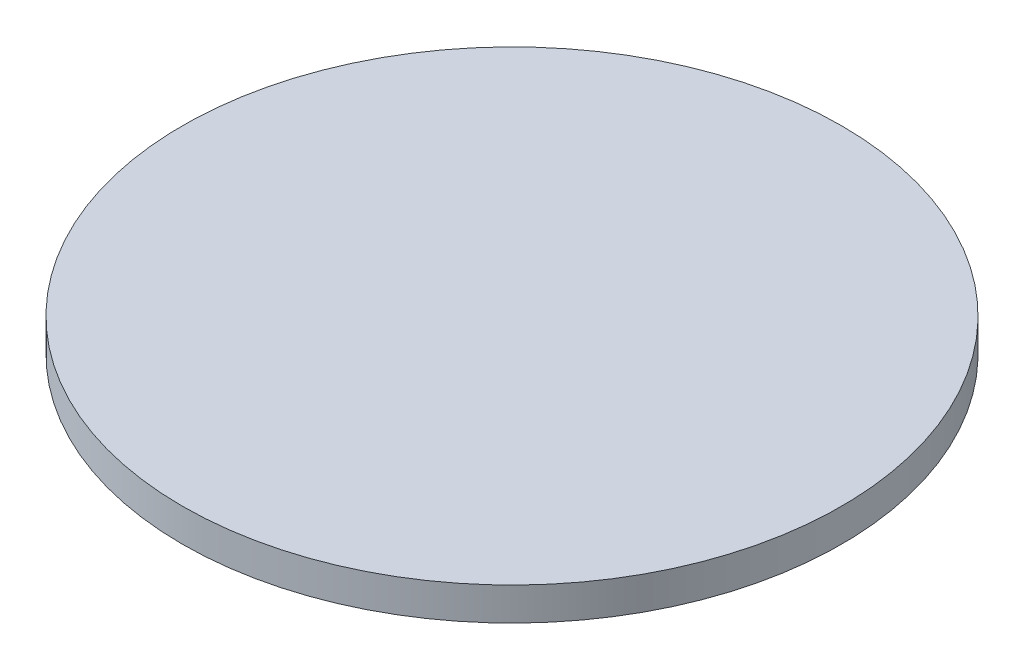
ISO-10303-21;
HEADER;
FILE_DESCRIPTION(('STEP AP214'),'2;1');
FILE_NAME('part.step','',(''),(''),'','','');
FILE_SCHEMA(('AUTOMOTIVE_DESIGN { 1 0 10303 214 1 1 1 1 }'));
ENDSEC;
DATA;
#1=APPLICATION_CONTEXT('core data for automotive mechanical design processes');
#2=APPLICATION_PROTOCOL_DEFINITION('international standard','automotive_design',2000,#1);
#3=PRODUCT_CONTEXT('',#1,'mechanical');
#4=PRODUCT('Part','Part','',(#3));
#5=PRODUCT_RELATED_PRODUCT_CATEGORY('part','',(#4));
#6=PRODUCT_DEFINITION_FORMATION('','',#4);
#7=PRODUCT_DEFINITION_CONTEXT('part definition',#1,'design');
#8=PRODUCT_DEFINITION('design','',#6,#7);
#9=PRODUCT_DEFINITION_SHAPE('','',#8);
#10=(LENGTH_UNIT() NAMED_UNIT(*) SI_UNIT(.MILLI.,.METRE.));
#11=(NAMED_UNIT(*) PLANE_ANGLE_UNIT() SI_UNIT($,.RADIAN.));
#12=(NAMED_UNIT(*) SI_UNIT($,.STERADIAN.) SOLID_ANGLE_UNIT());
#13=UNCERTAINTY_MEASURE_WITH_UNIT(LENGTH_MEASURE(1.E-05),#10,'distance_accuracy_value','');
#14=(GEOMETRIC_REPRESENTATION_CONTEXT(3) GLOBAL_UNCERTAINTY_ASSIGNED_CONTEXT((#13)) GLOBAL_UNIT_ASSIGNED_CONTEXT((#10,
#11,#12)) REPRESENTATION_CONTEXT('',''));
#15=CARTESIAN_POINT('',(0.,0.,0.));
#16=DIRECTION('',(0.,0.,1.));
#17=DIRECTION('',(1.,0.,0.));
#18=AXIS2_PLACEMENT_3D('',#15,#16,#17);
#19=CARTESIAN_POINT('',(0.,1.,0.));
#20=DIRECTION('',(0.,-1.,0.));
#21=DIRECTION('',(0.,0.,-1.));
#22=AXIS2_PLACEMENT_3D('',#19,#20,#21);
#23=CYLINDRICAL_SURFACE('',#22,20.);
#24=CARTESIAN_POINT('',(0.,1.,0.));
#25=DIRECTION('',(0.,1.,0.));
#26=DIRECTION('',(0.,0.,1.));
#27=AXIS2_PLACEMENT_3D('',#24,#25,#26);
#28=CIRCLE('',#27,20.);
#29=CARTESIAN_POINT('',(0.,1.,20.));
#30=VERTEX_POINT('',#29);
#31=EDGE_CURVE('E10',#30,#30,#28,.T.);
#32=ORIENTED_EDGE('',*,*,#31,.F.);
#33=EDGE_LOOP('',(#32));
#34=FACE_BOUND('',#33,.T.);
#35=CARTESIAN_POINT('',(0.,-1.,0.));
#36=DIRECTION('',(0.,1.,0.));
#37=DIRECTION('',(0.,0.,1.));
#38=AXIS2_PLACEMENT_3D('',#35,#36,#37);
#39=CIRCLE('',#38,20.);
#40=CARTESIAN_POINT('',(0.,-1.,20.));
#41=VERTEX_POINT('',#40);
#42=EDGE_CURVE('E42',#41,#41,#39,.T.);
#43=ORIENTED_EDGE('',*,*,#42,.T.);
#44=EDGE_LOOP('',(#43));
#45=FACE_BOUND('',#44,.T.);
#46=ADVANCED_FACE('F39',(#34,#45),#23,.T.);
#47=CARTESIAN_POINT('',(0.,1.,0.));
#48=DIRECTION('',(0.,1.,0.));
#49=DIRECTION('',(0.,0.,1.));
#50=AXIS2_PLACEMENT_3D('',#47,#48,#49);
#51=PLANE('',#50);
#52=ORIENTED_EDGE('',*,*,#31,.T.);
#53=EDGE_LOOP('',(#52));
#54=FACE_BOUND('',#53,.T.);
#55=ADVANCED_FACE('F54',(#54),#51,.T.);
#56=CARTESIAN_POINT('',(0.,-1.,0.));
#57=DIRECTION('',(0.,1.,0.));
#58=DIRECTION('',(0.,0.,1.));
#59=AXIS2_PLACEMENT_3D('',#56,#57,#58);
#60=PLANE('',#59);
#61=ORIENTED_EDGE('',*,*,#42,.F.);
#62=EDGE_LOOP('',(#61));
#63=FACE_BOUND('',#62,.T.);
#64=ADVANCED_FACE('F52',(#63),#60,.F.);
#65=CLOSED_SHELL('',(#46,#55,#64));
#66=MANIFOLD_SOLID_BREP('B2',#65);
#67=ADVANCED_BREP_SHAPE_REPRESENTATION('',(#18,#66),#14);
#68=SHAPE_DEFINITION_REPRESENTATION(#9,#67);
ENDSEC;
END-ISO-10303-21;
